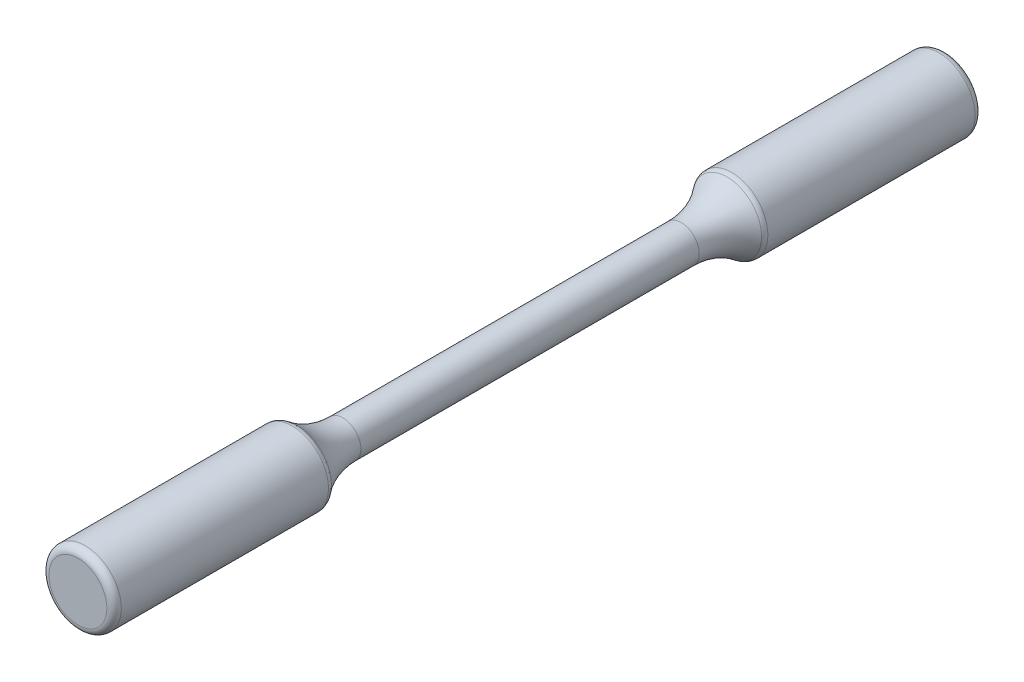
ISO-10303-21;
HEADER;
FILE_DESCRIPTION(('STEP AP214'),'2;1');
FILE_NAME('part.step','',(''),(''),'','','');
FILE_SCHEMA(('AUTOMOTIVE_DESIGN { 1 0 10303 214 1 1 1 1 }'));
ENDSEC;
DATA;
#1=APPLICATION_CONTEXT('core data for automotive mechanical design processes');
#2=APPLICATION_PROTOCOL_DEFINITION('international standard','automotive_design',2000,#1);
#3=PRODUCT_CONTEXT('',#1,'mechanical');
#4=PRODUCT('Part','Part','',(#3));
#5=PRODUCT_RELATED_PRODUCT_CATEGORY('part','',(#4));
#6=PRODUCT_DEFINITION_FORMATION('','',#4);
#7=PRODUCT_DEFINITION_CONTEXT('part definition',#1,'design');
#8=PRODUCT_DEFINITION('design','',#6,#7);
#9=PRODUCT_DEFINITION_SHAPE('','',#8);
#10=(LENGTH_UNIT() NAMED_UNIT(*) SI_UNIT(.MILLI.,.METRE.));
#11=(NAMED_UNIT(*) PLANE_ANGLE_UNIT() SI_UNIT($,.RADIAN.));
#12=(NAMED_UNIT(*) SI_UNIT($,.STERADIAN.) SOLID_ANGLE_UNIT());
#13=UNCERTAINTY_MEASURE_WITH_UNIT(LENGTH_MEASURE(1.E-05),#10,'distance_accuracy_value','');
#14=(GEOMETRIC_REPRESENTATION_CONTEXT(3) GLOBAL_UNCERTAINTY_ASSIGNED_CONTEXT((#13)) GLOBAL_UNIT_ASSIGNED_CONTEXT((#10,
#11,#12)) REPRESENTATION_CONTEXT('',''));
#15=CARTESIAN_POINT('',(0.,0.,0.));
#16=DIRECTION('',(0.,0.,1.));
#17=DIRECTION('',(1.,0.,0.));
#18=AXIS2_PLACEMENT_3D('',#15,#16,#17);
#19=CARTESIAN_POINT('',(0.,0.,60.));
#20=DIRECTION('',(0.,0.,-1.));
#21=DIRECTION('',(-1.,0.,0.));
#22=AXIS2_PLACEMENT_3D('',#19,#20,#21);
#23=CYLINDRICAL_SURFACE('',#22,2.5);
#24=CARTESIAN_POINT('',(0.,0.,6.61437827766147));
#25=DIRECTION('',(0.,0.,-1.));
#26=DIRECTION('',(-1.,0.,0.));
#27=AXIS2_PLACEMENT_3D('',#24,#25,#26);
#28=CIRCLE('',#27,2.5);
#29=CARTESIAN_POINT('',(-2.5,0.,6.61437827766147));
#30=VERTEX_POINT('',#29);
#31=EDGE_CURVE('E70',#30,#30,#28,.F.);
#32=ORIENTED_EDGE('',*,*,#31,.T.);
#33=EDGE_LOOP('',(#32));
#34=FACE_BOUND('',#33,.T.);
#35=CARTESIAN_POINT('',(0.,0.,53.3856217223385));
#36=DIRECTION('',(0.,0.,1.));
#37=DIRECTION('',(1.,0.,0.));
#38=AXIS2_PLACEMENT_3D('',#35,#36,#37);
#39=CIRCLE('',#38,2.5);
#40=CARTESIAN_POINT('',(2.5,0.,53.3856217223385));
#41=VERTEX_POINT('',#40);
#42=EDGE_CURVE('E73',#41,#41,#39,.F.);
#43=ORIENTED_EDGE('',*,*,#42,.T.);
#44=EDGE_LOOP('',(#43));
#45=FACE_BOUND('',#44,.T.);
#46=ADVANCED_FACE('F38',(#34,#45),#23,.T.);
#47=CARTESIAN_POINT('',(0.,0.,90.));
#48=DIRECTION('',(0.,0.,-1.));
#49=DIRECTION('',(-1.,0.,0.));
#50=AXIS2_PLACEMENT_3D('',#47,#48,#49);
#51=CYLINDRICAL_SURFACE('',#50,5.);
#52=CARTESIAN_POINT('',(0.,0.,60.367741744223));
#53=DIRECTION('',(0.,0.,-1.));
#54=DIRECTION('',(-1.,0.,0.));
#55=AXIS2_PLACEMENT_3D('',#52,#53,#54);
#56=CIRCLE('',#55,5.);
#57=CARTESIAN_POINT('',(-5.,0.,60.367741744223));
#58=VERTEX_POINT('',#57);
#59=EDGE_CURVE('E45',#58,#58,#56,.F.);
#60=ORIENTED_EDGE('',*,*,#59,.T.);
#61=EDGE_LOOP('',(#60));
#62=FACE_BOUND('',#61,.T.);
#63=CARTESIAN_POINT('',(0.,0.,89.));
#64=DIRECTION('',(0.,0.,1.));
#65=DIRECTION('',(1.,0.,0.));
#66=AXIS2_PLACEMENT_3D('',#63,#64,#65);
#67=CIRCLE('',#66,5.);
#68=CARTESIAN_POINT('',(5.,0.,89.));
#69=VERTEX_POINT('',#68);
#70=EDGE_CURVE('E58',#69,#69,#67,.F.);
#71=ORIENTED_EDGE('',*,*,#70,.T.);
#72=EDGE_LOOP('',(#71));
#73=FACE_BOUND('',#72,.T.);
#74=ADVANCED_FACE('F94',(#62,#73),#51,.T.);
#75=CARTESIAN_POINT('',(0.,0.,90.));
#76=DIRECTION('',(0.,0.,1.));
#77=DIRECTION('',(1.,0.,0.));
#78=AXIS2_PLACEMENT_3D('',#75,#76,#77);
#79=PLANE('',#78);
#80=CARTESIAN_POINT('',(0.,0.,90.));
#81=DIRECTION('',(0.,0.,1.));
#82=DIRECTION('',(1.,0.,0.));
#83=AXIS2_PLACEMENT_3D('',#80,#81,#82);
#84=CIRCLE('',#83,4.);
#85=CARTESIAN_POINT('',(4.,0.,90.));
#86=VERTEX_POINT('',#85);
#87=EDGE_CURVE('E61',#86,#86,#84,.T.);
#88=ORIENTED_EDGE('',*,*,#87,.T.);
#89=EDGE_LOOP('',(#88));
#90=FACE_BOUND('',#89,.T.);
#91=ADVANCED_FACE('F100',(#90),#79,.T.);
#92=CARTESIAN_POINT('',(0.,0.,-30.));
#93=DIRECTION('',(0.,0.,1.));
#94=DIRECTION('',(1.,0.,0.));
#95=AXIS2_PLACEMENT_3D('',#92,#93,#94);
#96=CYLINDRICAL_SURFACE('',#95,5.);
#97=CARTESIAN_POINT('',(0.,0.,-0.367741744222997));
#98=DIRECTION('',(0.,0.,1.));
#99=DIRECTION('',(1.,0.,0.));
#100=AXIS2_PLACEMENT_3D('',#97,#98,#99);
#101=CIRCLE('',#100,5.);
#102=CARTESIAN_POINT('',(5.,0.,-0.367741744222997));
#103=VERTEX_POINT('',#102);
#104=EDGE_CURVE('E53',#103,#103,#101,.F.);
#105=ORIENTED_EDGE('',*,*,#104,.T.);
#106=EDGE_LOOP('',(#105));
#107=FACE_BOUND('',#106,.T.);
#108=CARTESIAN_POINT('',(0.,0.,-29.));
#109=DIRECTION('',(0.,0.,-1.));
#110=DIRECTION('',(-1.,0.,0.));
#111=AXIS2_PLACEMENT_3D('',#108,#109,#110);
#112=CIRCLE('',#111,5.);
#113=CARTESIAN_POINT('',(-5.,0.,-29.));
#114=VERTEX_POINT('',#113);
#115=EDGE_CURVE('E64',#114,#114,#112,.F.);
#116=ORIENTED_EDGE('',*,*,#115,.T.);
#117=EDGE_LOOP('',(#116));
#118=FACE_BOUND('',#117,.T.);
#119=ADVANCED_FACE('F105',(#107,#118),#96,.T.);
#120=CARTESIAN_POINT('',(0.,0.,-30.));
#121=DIRECTION('',(0.,0.,-1.));
#122=DIRECTION('',(-1.,0.,0.));
#123=AXIS2_PLACEMENT_3D('',#120,#121,#122);
#124=PLANE('',#123);
#125=CARTESIAN_POINT('',(0.,0.,-30.));
#126=DIRECTION('',(0.,0.,-1.));
#127=DIRECTION('',(-1.,0.,0.));
#128=AXIS2_PLACEMENT_3D('',#125,#126,#127);
#129=CIRCLE('',#128,4.);
#130=CARTESIAN_POINT('',(-4.,0.,-30.));
#131=VERTEX_POINT('',#130);
#132=EDGE_CURVE('E67',#131,#131,#129,.T.);
#133=ORIENTED_EDGE('',*,*,#132,.T.);
#134=EDGE_LOOP('',(#133));
#135=FACE_BOUND('',#134,.T.);
#136=ADVANCED_FACE('F90',(#135),#124,.T.);
#137=CARTESIAN_POINT('',(0.,0.,6.61437827766148));
#138=DIRECTION('',(0.,0.,-1.));
#139=DIRECTION('',(-1.,0.,0.));
#140=AXIS2_PLACEMENT_3D('',#137,#138,#139);
#141=TOROIDAL_SURFACE('',#140,12.5,10.);
#142=CARTESIAN_POINT('',(0.,0.,0.266996439584684));
#143=DIRECTION('',(0.,0.,1.));
#144=DIRECTION('',(1.,0.,0.));
#145=AXIS2_PLACEMENT_3D('',#142,#143,#144);
#146=CIRCLE('',#145,4.77272727272727);
#147=CARTESIAN_POINT('',(4.77272727272727,0.,0.266996439584684));
#148=VERTEX_POINT('',#147);
#149=EDGE_CURVE('E49',#148,#148,#146,.T.);
#150=ORIENTED_EDGE('',*,*,#149,.T.);
#151=EDGE_LOOP('',(#150));
#152=FACE_BOUND('',#151,.T.);
#153=ORIENTED_EDGE('',*,*,#31,.F.);
#154=EDGE_LOOP('',(#153));
#155=FACE_BOUND('',#154,.T.);
#156=ADVANCED_FACE('F81',(#152,#155),#141,.F.);
#157=CARTESIAN_POINT('',(0.,0.,53.3856217223385));
#158=DIRECTION('',(0.,0.,1.));
#159=DIRECTION('',(1.,0.,0.));
#160=AXIS2_PLACEMENT_3D('',#157,#158,#159);
#161=TOROIDAL_SURFACE('',#160,12.5,10.);
#162=CARTESIAN_POINT('',(0.,0.,59.7330035604153));
#163=DIRECTION('',(0.,0.,-1.));
#164=DIRECTION('',(-1.,0.,0.));
#165=AXIS2_PLACEMENT_3D('',#162,#163,#164);
#166=CIRCLE('',#165,4.77272727272727);
#167=CARTESIAN_POINT('',(-4.77272727272727,0.,59.7330035604153));
#168=VERTEX_POINT('',#167);
#169=EDGE_CURVE('E10',#168,#168,#166,.T.);
#170=ORIENTED_EDGE('',*,*,#169,.T.);
#171=EDGE_LOOP('',(#170));
#172=FACE_BOUND('',#171,.T.);
#173=ORIENTED_EDGE('',*,*,#42,.F.);
#174=EDGE_LOOP('',(#173));
#175=FACE_BOUND('',#174,.T.);
#176=ADVANCED_FACE('F78',(#172,#175),#161,.F.);
#177=CARTESIAN_POINT('',(0.,0.,-29.));
#178=DIRECTION('',(0.,0.,-1.));
#179=DIRECTION('',(-1.,0.,0.));
#180=AXIS2_PLACEMENT_3D('',#177,#178,#179);
#181=TOROIDAL_SURFACE('',#180,4.,1.);
#182=ORIENTED_EDGE('',*,*,#115,.F.);
#183=EDGE_LOOP('',(#182));
#184=FACE_BOUND('',#183,.T.);
#185=ORIENTED_EDGE('',*,*,#132,.F.);
#186=EDGE_LOOP('',(#185));
#187=FACE_BOUND('',#186,.T.);
#188=ADVANCED_FACE('F80',(#184,#187),#181,.T.);
#189=CARTESIAN_POINT('',(0.,0.,89.));
#190=DIRECTION('',(0.,0.,1.));
#191=DIRECTION('',(1.,0.,0.));
#192=AXIS2_PLACEMENT_3D('',#189,#190,#191);
#193=TOROIDAL_SURFACE('',#192,4.,1.);
#194=ORIENTED_EDGE('',*,*,#70,.F.);
#195=EDGE_LOOP('',(#194));
#196=FACE_BOUND('',#195,.T.);
#197=ORIENTED_EDGE('',*,*,#87,.F.);
#198=EDGE_LOOP('',(#197));
#199=FACE_BOUND('',#198,.T.);
#200=ADVANCED_FACE('F87',(#196,#199),#193,.T.);
#201=CARTESIAN_POINT('',(0.,0.,-0.367741744222995));
#202=DIRECTION('',(0.,0.,1.));
#203=DIRECTION('',(1.,0.,0.));
#204=AXIS2_PLACEMENT_3D('',#201,#202,#203);
#205=TOROIDAL_SURFACE('',#204,4.,1.);
#206=ORIENTED_EDGE('',*,*,#149,.F.);
#207=EDGE_LOOP('',(#206));
#208=FACE_BOUND('',#207,.T.);
#209=ORIENTED_EDGE('',*,*,#104,.F.);
#210=EDGE_LOOP('',(#209));
#211=FACE_BOUND('',#210,.T.);
#212=ADVANCED_FACE('F139',(#208,#211),#205,.T.);
#213=CARTESIAN_POINT('',(0.,0.,60.367741744223));
#214=DIRECTION('',(0.,0.,-1.));
#215=DIRECTION('',(-1.,0.,0.));
#216=AXIS2_PLACEMENT_3D('',#213,#214,#215);
#217=TOROIDAL_SURFACE('',#216,4.,1.);
#218=ORIENTED_EDGE('',*,*,#169,.F.);
#219=EDGE_LOOP('',(#218));
#220=FACE_BOUND('',#219,.T.);
#221=ORIENTED_EDGE('',*,*,#59,.F.);
#222=EDGE_LOOP('',(#221));
#223=FACE_BOUND('',#222,.T.);
#224=ADVANCED_FACE('F40',(#220,#223),#217,.T.);
#225=CLOSED_SHELL('',(#46,#74,#91,#119,#136,#156,#176,#188,#200,#212,#224));
#226=MANIFOLD_SOLID_BREP('B2',#225);
#227=ADVANCED_BREP_SHAPE_REPRESENTATION('',(#18,#226),#14);
#228=SHAPE_DEFINITION_REPRESENTATION(#9,#227);
ENDSEC;
END-ISO-10303-21;
